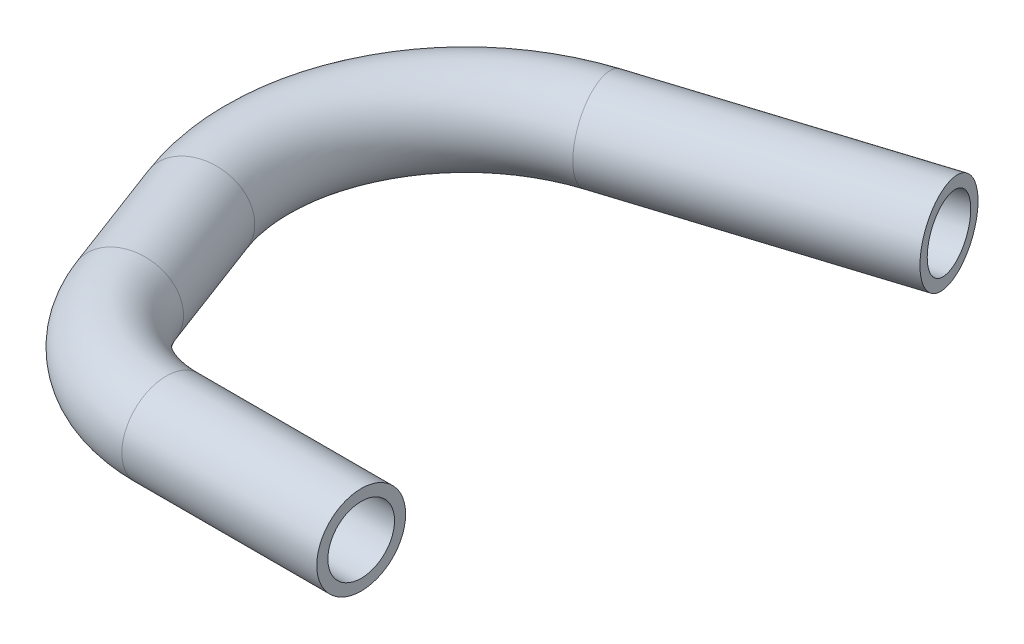
ISO-10303-21;
HEADER;
FILE_DESCRIPTION(('STEP AP214'),'2;1');
FILE_NAME('part.step','',(''),(''),'','','');
FILE_SCHEMA(('AUTOMOTIVE_DESIGN { 1 0 10303 214 1 1 1 1 }'));
ENDSEC;
DATA;
#1=APPLICATION_CONTEXT('core data for automotive mechanical design processes');
#2=APPLICATION_PROTOCOL_DEFINITION('international standard','automotive_design',2000,#1);
#3=PRODUCT_CONTEXT('',#1,'mechanical');
#4=PRODUCT('Part','Part','',(#3));
#5=PRODUCT_RELATED_PRODUCT_CATEGORY('part','',(#4));
#6=PRODUCT_DEFINITION_FORMATION('','',#4);
#7=PRODUCT_DEFINITION_CONTEXT('part definition',#1,'design');
#8=PRODUCT_DEFINITION('design','',#6,#7);
#9=PRODUCT_DEFINITION_SHAPE('','',#8);
#10=(LENGTH_UNIT() NAMED_UNIT(*) SI_UNIT(.MILLI.,.METRE.));
#11=(NAMED_UNIT(*) PLANE_ANGLE_UNIT() SI_UNIT($,.RADIAN.));
#12=(NAMED_UNIT(*) SI_UNIT($,.STERADIAN.) SOLID_ANGLE_UNIT());
#13=UNCERTAINTY_MEASURE_WITH_UNIT(LENGTH_MEASURE(1.E-05),#10,'distance_accuracy_value','');
#14=(GEOMETRIC_REPRESENTATION_CONTEXT(3) GLOBAL_UNCERTAINTY_ASSIGNED_CONTEXT((#13)) GLOBAL_UNIT_ASSIGNED_CONTEXT((#10,
#11,#12)) REPRESENTATION_CONTEXT('',''));
#15=CARTESIAN_POINT('',(0.,0.,0.));
#16=DIRECTION('',(0.,0.,1.));
#17=DIRECTION('',(1.,0.,0.));
#18=AXIS2_PLACEMENT_3D('',#15,#16,#17);
#19=CARTESIAN_POINT('',(0.,0.,0.));
#20=DIRECTION('',(-1.,0.,0.));
#21=DIRECTION('',(0.,0.,1.));
#22=AXIS2_PLACEMENT_3D('',#19,#20,#21);
#23=CYLINDRICAL_SURFACE('',#22,16.);
#24=CARTESIAN_POINT('',(-70.1970105,0.,0.));
#25=DIRECTION('',(1.,0.,0.));
#26=DIRECTION('',(0.,0.,-1.));
#27=AXIS2_PLACEMENT_3D('',#24,#25,#26);
#28=CIRCLE('',#27,16.);
#29=CARTESIAN_POINT('',(-70.1970105,0.,16.));
#30=VERTEX_POINT('',#29);
#31=EDGE_CURVE('E55',#30,#30,#28,.T.);
#32=ORIENTED_EDGE('',*,*,#31,.T.);
#33=EDGE_LOOP('',(#32));
#34=FACE_BOUND('',#33,.T.);
#35=CARTESIAN_POINT('',(0.,0.,0.));
#36=DIRECTION('',(1.,0.,0.));
#37=DIRECTION('',(0.,0.,-1.));
#38=AXIS2_PLACEMENT_3D('',#35,#36,#37);
#39=CIRCLE('',#38,16.);
#40=CARTESIAN_POINT('',(0.,0.,-16.));
#41=VERTEX_POINT('',#40);
#42=EDGE_CURVE('E52',#41,#41,#39,.T.);
#43=ORIENTED_EDGE('',*,*,#42,.F.);
#44=EDGE_LOOP('',(#43));
#45=FACE_BOUND('',#44,.T.);
#46=ADVANCED_FACE('F31',(#34,#45),#23,.T.);
#47=CARTESIAN_POINT('',(-70.1970105,0.,-50.));
#48=DIRECTION('',(0.,-1.,0.));
#49=DIRECTION('',(0.,0.,-1.));
#50=AXIS2_PLACEMENT_3D('',#47,#48,#49);
#51=TOROIDAL_SURFACE('',#50,50.,16.);
#52=CARTESIAN_POINT('',(-116.992532349691,0.,-32.3880967861184));
#53=DIRECTION('',(0.352238064277631,0.,0.935910436993812));
#54=DIRECTION('',(0.935910436993812,0.,-0.352238064277631));
#55=AXIS2_PLACEMENT_3D('',#52,#53,#54);
#56=CIRCLE('',#55,16.);
#57=CARTESIAN_POINT('',(-131.967099341592,0.,-26.7522877576763));
#58=VERTEX_POINT('',#57);
#59=EDGE_CURVE('E58',#58,#58,#56,.T.);
#60=CARTESIAN_POINT('',(-70.1970105,0.,-50.));
#61=DIRECTION('',(0.,-1.,0.));
#62=DIRECTION('',(0.,0.,-1.));
#63=AXIS2_PLACEMENT_3D('',#60,#61,#62);
#64=CIRCLE('',#63,66.);
#65=EDGE_CURVE('',#30,#58,#64,.T.);
#66=ORIENTED_EDGE('',*,*,#31,.F.);
#67=ORIENTED_EDGE('',*,*,#59,.T.);
#68=ORIENTED_EDGE('',*,*,#65,.T.);
#69=ORIENTED_EDGE('',*,*,#65,.F.);
#70=EDGE_LOOP('',(#66,#68,#67,#69));
#71=FACE_BOUND('',#70,.T.);
#72=ADVANCED_FACE('F100',(#71),#51,.T.);
#73=CARTESIAN_POINT('',(-116.992532349691,0.,-32.3880967861184));
#74=DIRECTION('',(-0.352238064277632,0.,-0.935910436993811));
#75=DIRECTION('',(-0.935910436993811,0.,0.352238064277632));
#76=AXIS2_PLACEMENT_3D('',#73,#74,#75);
#77=CYLINDRICAL_SURFACE('',#76,16.);
#78=CARTESIAN_POINT('',(-132.496272122416,0.,-73.5821451791775));
#79=DIRECTION('',(0.352238064277631,0.,0.935910436993811));
#80=DIRECTION('',(0.935910436993811,0.,-0.352238064277631));
#81=AXIS2_PLACEMENT_3D('',#78,#79,#80);
#82=CIRCLE('',#81,16.);
#83=CARTESIAN_POINT('',(-147.470839114317,0.,-67.9463361507354));
#84=VERTEX_POINT('',#83);
#85=EDGE_CURVE('E60',#84,#84,#82,.T.);
#86=ORIENTED_EDGE('',*,*,#85,.T.);
#87=EDGE_LOOP('',(#86));
#88=FACE_BOUND('',#87,.T.);
#89=ORIENTED_EDGE('',*,*,#59,.F.);
#90=EDGE_LOOP('',(#89));
#91=FACE_BOUND('',#90,.T.);
#92=ADVANCED_FACE('F80',(#88,#91),#77,.T.);
#93=CARTESIAN_POINT('',(-62.3029893478805,0.,-99.9999999999999));
#94=DIRECTION('',(0.,-1.,0.));
#95=DIRECTION('',(0.,0.,-1.));
#96=AXIS2_PLACEMENT_3D('',#93,#94,#95);
#97=TOROIDAL_SURFACE('',#96,75.,16.);
#98=CARTESIAN_POINT('',(-84.8559243107008,0.,-171.528771306117));
#99=DIRECTION('',(-0.953716950748228,0.,0.30070579950427));
#100=DIRECTION('',(0.30070579950427,0.,0.953716950748228));
#101=AXIS2_PLACEMENT_3D('',#98,#99,#100);
#102=CIRCLE('',#101,16.);
#103=CARTESIAN_POINT('',(-89.6672171027692,0.,-186.788242518089));
#104=VERTEX_POINT('',#103);
#105=EDGE_CURVE('E35',#104,#104,#102,.T.);
#106=CARTESIAN_POINT('',(-62.3029893478805,0.,-99.9999999999999));
#107=DIRECTION('',(0.,-1.,0.));
#108=DIRECTION('',(0.,0.,-1.));
#109=AXIS2_PLACEMENT_3D('',#106,#107,#108);
#110=CIRCLE('',#109,91.);
#111=EDGE_CURVE('',#84,#104,#110,.T.);
#112=ORIENTED_EDGE('',*,*,#85,.F.);
#113=ORIENTED_EDGE('',*,*,#105,.T.);
#114=ORIENTED_EDGE('',*,*,#111,.T.);
#115=ORIENTED_EDGE('',*,*,#111,.F.);
#116=EDGE_LOOP('',(#112,#114,#113,#115));
#117=FACE_BOUND('',#116,.T.);
#118=ADVANCED_FACE('F67',(#117),#97,.T.);
#119=CARTESIAN_POINT('',(-84.8559243107008,0.,-171.528771306117));
#120=DIRECTION('',(0.953716950748227,0.,-0.300705799504272));
#121=DIRECTION('',(-0.300705799504272,0.,-0.953716950748227));
#122=AXIS2_PLACEMENT_3D('',#119,#120,#121);
#123=CYLINDRICAL_SURFACE('',#122,16.);
#124=CARTESIAN_POINT('',(10.1970106521194,0.,-201.498846579287));
#125=DIRECTION('',(-0.953716950748227,0.,0.300705799504272));
#126=DIRECTION('',(0.300705799504272,0.,0.953716950748227));
#127=AXIS2_PLACEMENT_3D('',#124,#125,#126);
#128=CIRCLE('',#127,16.);
#129=CARTESIAN_POINT('',(15.0083034441878,0.,-186.239375367315));
#130=VERTEX_POINT('',#129);
#131=EDGE_CURVE('E48',#130,#130,#128,.T.);
#132=ORIENTED_EDGE('',*,*,#131,.T.);
#133=EDGE_LOOP('',(#132));
#134=FACE_BOUND('',#133,.T.);
#135=ORIENTED_EDGE('',*,*,#105,.F.);
#136=EDGE_LOOP('',(#135));
#137=FACE_BOUND('',#136,.T.);
#138=ADVANCED_FACE('F33',(#134,#137),#123,.T.);
#139=CARTESIAN_POINT('',(0.,0.,0.));
#140=DIRECTION('',(1.,0.,0.));
#141=DIRECTION('',(0.,0.,-1.));
#142=AXIS2_PLACEMENT_3D('',#139,#140,#141);
#143=PLANE('',#142);
#144=CARTESIAN_POINT('',(0.,0.,0.));
#145=DIRECTION('',(1.,0.,0.));
#146=DIRECTION('',(0.,0.,-1.));
#147=AXIS2_PLACEMENT_3D('',#144,#145,#146);
#148=CIRCLE('',#147,12.);
#149=CARTESIAN_POINT('',(0.,0.,-12.));
#150=VERTEX_POINT('',#149);
#151=EDGE_CURVE('E51',#150,#150,#148,.F.);
#152=ORIENTED_EDGE('',*,*,#151,.T.);
#153=EDGE_LOOP('',(#152));
#154=FACE_BOUND('',#153,.T.);
#155=ORIENTED_EDGE('',*,*,#42,.T.);
#156=EDGE_LOOP('',(#155));
#157=FACE_BOUND('',#156,.T.);
#158=ADVANCED_FACE('F71',(#154,#157),#143,.T.);
#159=CARTESIAN_POINT('',(10.1970106521194,0.,-201.498846579287));
#160=DIRECTION('',(-0.953716950748227,0.,0.300705799504272));
#161=DIRECTION('',(0.300705799504272,0.,0.953716950748227));
#162=AXIS2_PLACEMENT_3D('',#159,#160,#161);
#163=PLANE('',#162);
#164=CARTESIAN_POINT('',(10.1970106521194,0.,-201.498846579287));
#165=DIRECTION('',(-0.953716950748227,0.,0.300705799504272));
#166=DIRECTION('',(0.300705799504272,0.,0.953716950748227));
#167=AXIS2_PLACEMENT_3D('',#164,#165,#166);
#168=CIRCLE('',#167,12.);
#169=CARTESIAN_POINT('',(13.8054802461707,0.,-190.054243170308));
#170=VERTEX_POINT('',#169);
#171=EDGE_CURVE('E10',#170,#170,#168,.F.);
#172=ORIENTED_EDGE('',*,*,#171,.F.);
#173=EDGE_LOOP('',(#172));
#174=FACE_BOUND('',#173,.T.);
#175=ORIENTED_EDGE('',*,*,#131,.F.);
#176=EDGE_LOOP('',(#175));
#177=FACE_BOUND('',#176,.T.);
#178=ADVANCED_FACE('F77',(#174,#177),#163,.F.);
#179=CARTESIAN_POINT('',(0.,0.,0.));
#180=DIRECTION('',(-1.,0.,0.));
#181=DIRECTION('',(0.,0.,1.));
#182=AXIS2_PLACEMENT_3D('',#179,#180,#181);
#183=CYLINDRICAL_SURFACE('',#182,12.);
#184=CARTESIAN_POINT('',(-70.1970105,0.,0.));
#185=DIRECTION('',(1.,0.,0.));
#186=DIRECTION('',(0.,0.,-1.));
#187=AXIS2_PLACEMENT_3D('',#184,#185,#186);
#188=CIRCLE('',#187,12.);
#189=CARTESIAN_POINT('',(-70.1970105,0.,12.));
#190=VERTEX_POINT('',#189);
#191=EDGE_CURVE('E184',#190,#190,#188,.F.);
#192=ORIENTED_EDGE('',*,*,#191,.T.);
#193=EDGE_LOOP('',(#192));
#194=FACE_BOUND('',#193,.T.);
#195=ORIENTED_EDGE('',*,*,#151,.F.);
#196=EDGE_LOOP('',(#195));
#197=FACE_BOUND('',#196,.T.);
#198=ADVANCED_FACE('F95',(#194,#197),#183,.F.);
#199=CARTESIAN_POINT('',(-70.1970105,0.,-50.));
#200=DIRECTION('',(0.,-1.,0.));
#201=DIRECTION('',(0.,0.,-1.));
#202=AXIS2_PLACEMENT_3D('',#199,#200,#201);
#203=TOROIDAL_SURFACE('',#202,50.,12.);
#204=CARTESIAN_POINT('',(-116.992532349691,0.,-32.3880967861184));
#205=DIRECTION('',(0.352238064277631,0.,0.935910436993812));
#206=DIRECTION('',(0.935910436993812,0.,-0.352238064277631));
#207=AXIS2_PLACEMENT_3D('',#204,#205,#206);
#208=CIRCLE('',#207,12.);
#209=CARTESIAN_POINT('',(-128.223457593616,0.,-28.1612400147868));
#210=VERTEX_POINT('',#209);
#211=EDGE_CURVE('E183',#210,#210,#208,.F.);
#212=CARTESIAN_POINT('',(-70.1970105,0.,-50.));
#213=DIRECTION('',(0.,-1.,0.));
#214=DIRECTION('',(0.,0.,-1.));
#215=AXIS2_PLACEMENT_3D('',#212,#213,#214);
#216=CIRCLE('',#215,62.);
#217=EDGE_CURVE('',#190,#210,#216,.T.);
#218=ORIENTED_EDGE('',*,*,#191,.F.);
#219=ORIENTED_EDGE('',*,*,#211,.T.);
#220=ORIENTED_EDGE('',*,*,#217,.T.);
#221=ORIENTED_EDGE('',*,*,#217,.F.);
#222=EDGE_LOOP('',(#218,#220,#219,#221));
#223=FACE_BOUND('',#222,.T.);
#224=ADVANCED_FACE('F146',(#223),#203,.F.);
#225=CARTESIAN_POINT('',(-116.992532349691,0.,-32.3880967861184));
#226=DIRECTION('',(-0.352238064277632,0.,-0.935910436993811));
#227=DIRECTION('',(-0.935910436993811,0.,0.352238064277632));
#228=AXIS2_PLACEMENT_3D('',#225,#226,#227);
#229=CYLINDRICAL_SURFACE('',#228,12.);
#230=CARTESIAN_POINT('',(-132.496272122416,0.,-73.5821451791775));
#231=DIRECTION('',(0.352238064277631,0.,0.935910436993811));
#232=DIRECTION('',(0.935910436993811,0.,-0.352238064277631));
#233=AXIS2_PLACEMENT_3D('',#230,#231,#232);
#234=CIRCLE('',#233,12.);
#235=CARTESIAN_POINT('',(-143.727197366342,0.,-69.3552884078459));
#236=VERTEX_POINT('',#235);
#237=EDGE_CURVE('E44',#236,#236,#234,.F.);
#238=ORIENTED_EDGE('',*,*,#237,.T.);
#239=EDGE_LOOP('',(#238));
#240=FACE_BOUND('',#239,.T.);
#241=ORIENTED_EDGE('',*,*,#211,.F.);
#242=EDGE_LOOP('',(#241));
#243=FACE_BOUND('',#242,.T.);
#244=ADVANCED_FACE('F88',(#240,#243),#229,.F.);
#245=CARTESIAN_POINT('',(-62.3029893478805,0.,-99.9999999999999));
#246=DIRECTION('',(0.,-1.,0.));
#247=DIRECTION('',(0.,0.,-1.));
#248=AXIS2_PLACEMENT_3D('',#245,#246,#247);
#249=TOROIDAL_SURFACE('',#248,75.,12.);
#250=CARTESIAN_POINT('',(-84.8559243107008,0.,-171.528771306117));
#251=DIRECTION('',(-0.953716950748228,0.,0.30070579950427));
#252=DIRECTION('',(0.30070579950427,0.,0.953716950748228));
#253=AXIS2_PLACEMENT_3D('',#250,#251,#252);
#254=CIRCLE('',#253,12.);
#255=CARTESIAN_POINT('',(-88.4643939047521,0.,-182.973374715096));
#256=VERTEX_POINT('',#255);
#257=EDGE_CURVE('E39',#256,#256,#254,.F.);
#258=CARTESIAN_POINT('',(-62.3029893478805,0.,-99.9999999999999));
#259=DIRECTION('',(0.,-1.,0.));
#260=DIRECTION('',(0.,0.,-1.));
#261=AXIS2_PLACEMENT_3D('',#258,#259,#260);
#262=CIRCLE('',#261,87.);
#263=EDGE_CURVE('',#236,#256,#262,.T.);
#264=ORIENTED_EDGE('',*,*,#237,.F.);
#265=ORIENTED_EDGE('',*,*,#257,.T.);
#266=ORIENTED_EDGE('',*,*,#263,.T.);
#267=ORIENTED_EDGE('',*,*,#263,.F.);
#268=EDGE_LOOP('',(#264,#266,#265,#267));
#269=FACE_BOUND('',#268,.T.);
#270=ADVANCED_FACE('F83',(#269),#249,.F.);
#271=CARTESIAN_POINT('',(-84.8559243107008,0.,-171.528771306117));
#272=DIRECTION('',(0.953716950748227,0.,-0.300705799504272));
#273=DIRECTION('',(-0.300705799504272,0.,-0.953716950748227));
#274=AXIS2_PLACEMENT_3D('',#271,#272,#273);
#275=CYLINDRICAL_SURFACE('',#274,12.);
#276=ORIENTED_EDGE('',*,*,#171,.T.);
#277=EDGE_LOOP('',(#276));
#278=FACE_BOUND('',#277,.T.);
#279=ORIENTED_EDGE('',*,*,#257,.F.);
#280=EDGE_LOOP('',(#279));
#281=FACE_BOUND('',#280,.T.);
#282=ADVANCED_FACE('F81',(#278,#281),#275,.F.);
#283=CLOSED_SHELL('',(#46,#72,#92,#118,#138,#158,#178,#198,#224,#244,#270,#282));
#284=MANIFOLD_SOLID_BREP('B2',#283);
#285=ADVANCED_BREP_SHAPE_REPRESENTATION('',(#18,#284),#14);
#286=SHAPE_DEFINITION_REPRESENTATION(#9,#285);
ENDSEC;
END-ISO-10303-21;
